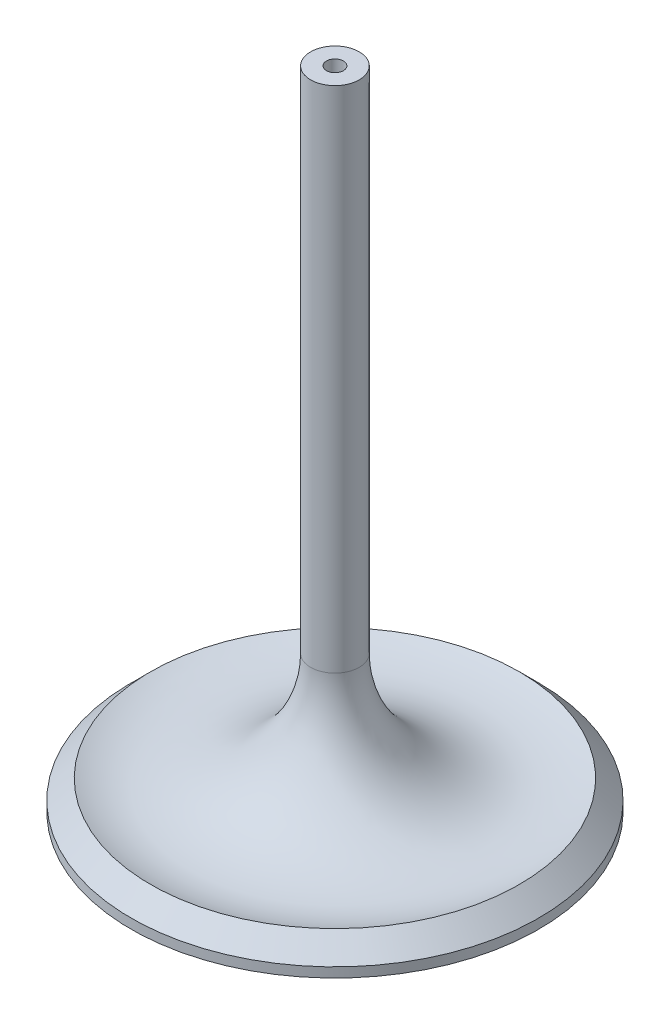
ISO-10303-21;
HEADER;
FILE_DESCRIPTION(('STEP AP214'),'2;1');
FILE_NAME('part.step','',(''),(''),'','','');
FILE_SCHEMA(('AUTOMOTIVE_DESIGN { 1 0 10303 214 1 1 1 1 }'));
ENDSEC;
DATA;
#1=APPLICATION_CONTEXT('core data for automotive mechanical design processes');
#2=APPLICATION_PROTOCOL_DEFINITION('international standard','automotive_design',2000,#1);
#3=PRODUCT_CONTEXT('',#1,'mechanical');
#4=PRODUCT('Part','Part','',(#3));
#5=PRODUCT_RELATED_PRODUCT_CATEGORY('part','',(#4));
#6=PRODUCT_DEFINITION_FORMATION('','',#4);
#7=PRODUCT_DEFINITION_CONTEXT('part definition',#1,'design');
#8=PRODUCT_DEFINITION('design','',#6,#7);
#9=PRODUCT_DEFINITION_SHAPE('','',#8);
#10=(LENGTH_UNIT() NAMED_UNIT(*) SI_UNIT(.MILLI.,.METRE.));
#11=(NAMED_UNIT(*) PLANE_ANGLE_UNIT() SI_UNIT($,.RADIAN.));
#12=(NAMED_UNIT(*) SI_UNIT($,.STERADIAN.) SOLID_ANGLE_UNIT());
#13=UNCERTAINTY_MEASURE_WITH_UNIT(LENGTH_MEASURE(1.E-05),#10,'distance_accuracy_value','');
#14=(GEOMETRIC_REPRESENTATION_CONTEXT(3) GLOBAL_UNCERTAINTY_ASSIGNED_CONTEXT((#13)) GLOBAL_UNIT_ASSIGNED_CONTEXT((#10,
#11,#12)) REPRESENTATION_CONTEXT('',''));
#15=CARTESIAN_POINT('',(0.,0.,0.));
#16=DIRECTION('',(0.,0.,1.));
#17=DIRECTION('',(1.,0.,0.));
#18=AXIS2_PLACEMENT_3D('',#15,#16,#17);
#19=CARTESIAN_POINT('',(0.,-10.65,0.));
#20=DIRECTION('',(0.,1.,0.));
#21=DIRECTION('',(0.,0.,1.));
#22=AXIS2_PLACEMENT_3D('',#19,#20,#21);
#23=CYLINDRICAL_SURFACE('',#22,1.10653535563735);
#24=CARTESIAN_POINT('',(0.,84.55,0.));
#25=DIRECTION('',(0.,1.,0.));
#26=DIRECTION('',(0.,0.,1.));
#27=AXIS2_PLACEMENT_3D('',#24,#25,#26);
#28=CIRCLE('',#27,1.10653535563735);
#29=CARTESIAN_POINT('',(0.,84.55,1.10653535563735));
#30=VERTEX_POINT('',#29);
#31=EDGE_CURVE('E76',#30,#30,#28,.T.);
#32=ORIENTED_EDGE('',*,*,#31,.T.);
#33=EDGE_LOOP('',(#32));
#34=FACE_BOUND('',#33,.T.);
#35=CARTESIAN_POINT('',(0.,2.2,0.));
#36=DIRECTION('',(0.,-1.,0.));
#37=DIRECTION('',(0.,0.,-1.));
#38=AXIS2_PLACEMENT_3D('',#35,#36,#37);
#39=CIRCLE('',#38,1.10653535563735);
#40=CARTESIAN_POINT('',(0.,2.2,-1.10653535563735));
#41=VERTEX_POINT('',#40);
#42=EDGE_CURVE('E47',#41,#41,#39,.F.);
#43=ORIENTED_EDGE('',*,*,#42,.F.);
#44=EDGE_LOOP('',(#43));
#45=FACE_BOUND('',#44,.T.);
#46=ADVANCED_FACE('F43',(#34,#45),#23,.F.);
#47=CARTESIAN_POINT('',(26.67,0.,0.));
#48=DIRECTION('',(0.,-1.,0.));
#49=DIRECTION('',(0.,0.,-1.));
#50=AXIS2_PLACEMENT_3D('',#47,#48,#49);
#51=PLANE('',#50);
#52=CARTESIAN_POINT('',(0.,0.,0.));
#53=DIRECTION('',(0.,-1.,0.));
#54=DIRECTION('',(0.,0.,-1.));
#55=AXIS2_PLACEMENT_3D('',#52,#53,#54);
#56=CIRCLE('',#55,14.510934510606);
#57=CARTESIAN_POINT('',(0.,0.,-14.510934510606));
#58=VERTEX_POINT('',#57);
#59=EDGE_CURVE('E72',#58,#58,#56,.T.);
#60=ORIENTED_EDGE('',*,*,#59,.F.);
#61=EDGE_LOOP('',(#60));
#62=FACE_BOUND('',#61,.T.);
#63=CARTESIAN_POINT('',(0.,0.,0.));
#64=DIRECTION('',(0.,-1.,0.));
#65=DIRECTION('',(0.,0.,-1.));
#66=AXIS2_PLACEMENT_3D('',#63,#64,#65);
#67=CIRCLE('',#66,26.67);
#68=CARTESIAN_POINT('',(0.,0.,-26.67));
#69=VERTEX_POINT('',#68);
#70=EDGE_CURVE('E10',#69,#69,#67,.T.);
#71=ORIENTED_EDGE('',*,*,#70,.T.);
#72=EDGE_LOOP('',(#71));
#73=FACE_BOUND('',#72,.T.);
#74=ADVANCED_FACE('F45',(#62,#73),#51,.T.);
#75=CARTESIAN_POINT('',(0.,0.,0.));
#76=DIRECTION('',(0.,-1.,0.));
#77=DIRECTION('',(0.,0.,-1.));
#78=AXIS2_PLACEMENT_3D('',#75,#76,#77);
#79=CYLINDRICAL_SURFACE('',#78,26.67);
#80=CARTESIAN_POINT('',(0.,1.27,0.));
#81=DIRECTION('',(0.,-1.,0.));
#82=DIRECTION('',(0.,0.,-1.));
#83=AXIS2_PLACEMENT_3D('',#80,#81,#82);
#84=CIRCLE('',#83,26.67);
#85=CARTESIAN_POINT('',(0.,1.27,-26.67));
#86=VERTEX_POINT('',#85);
#87=EDGE_CURVE('E52',#86,#86,#84,.T.);
#88=ORIENTED_EDGE('',*,*,#87,.T.);
#89=EDGE_LOOP('',(#88));
#90=FACE_BOUND('',#89,.T.);
#91=ORIENTED_EDGE('',*,*,#70,.F.);
#92=EDGE_LOOP('',(#91));
#93=FACE_BOUND('',#92,.T.);
#94=ADVANCED_FACE('F104',(#90,#93),#79,.T.);
#95=CARTESIAN_POINT('',(0.,1.27,0.));
#96=DIRECTION('',(0.,-1.,0.));
#97=DIRECTION('',(0.,0.,-1.));
#98=AXIS2_PLACEMENT_3D('',#95,#96,#97);
#99=CONICAL_SURFACE('',#98,26.67,0.785398163397456);
#100=CARTESIAN_POINT('',(0.,3.80999999999999,0.));
#101=DIRECTION('',(0.,-1.,0.));
#102=DIRECTION('',(0.,0.,-1.));
#103=AXIS2_PLACEMENT_3D('',#100,#101,#102);
#104=CIRCLE('',#103,24.13);
#105=CARTESIAN_POINT('',(0.,3.80999999999999,-24.13));
#106=VERTEX_POINT('',#105);
#107=EDGE_CURVE('E57',#106,#106,#104,.T.);
#108=ORIENTED_EDGE('',*,*,#107,.T.);
#109=EDGE_LOOP('',(#108));
#110=FACE_BOUND('',#109,.T.);
#111=ORIENTED_EDGE('',*,*,#87,.F.);
#112=EDGE_LOOP('',(#111));
#113=FACE_BOUND('',#112,.T.);
#114=ADVANCED_FACE('F129',(#110,#113),#99,.T.);
#115=CARTESIAN_POINT('',(0.,17.9546986535592,0.));
#116=DIRECTION('',(0.,-1.,0.));
#117=DIRECTION('',(0.,0.,-1.));
#118=AXIS2_PLACEMENT_3D('',#115,#116,#117);
#119=TOROIDAL_SURFACE('',#118,18.43,15.25);
#120=CARTESIAN_POINT('',(0.,17.9546986535592,0.));
#121=DIRECTION('',(0.,-1.,0.));
#122=DIRECTION('',(0.,0.,-1.));
#123=AXIS2_PLACEMENT_3D('',#120,#121,#122);
#124=CIRCLE('',#123,3.18000000000001);
#125=CARTESIAN_POINT('',(0.,17.9546986535592,-3.18000000000001));
#126=VERTEX_POINT('',#125);
#127=EDGE_CURVE('E63',#126,#126,#124,.T.);
#128=ORIENTED_EDGE('',*,*,#127,.T.);
#129=EDGE_LOOP('',(#128));
#130=FACE_BOUND('',#129,.T.);
#131=ORIENTED_EDGE('',*,*,#107,.F.);
#132=EDGE_LOOP('',(#131));
#133=FACE_BOUND('',#132,.T.);
#134=ADVANCED_FACE('F125',(#130,#133),#119,.F.);
#135=CARTESIAN_POINT('',(0.,0.,0.));
#136=DIRECTION('',(0.,-1.,0.));
#137=DIRECTION('',(0.,0.,-1.));
#138=AXIS2_PLACEMENT_3D('',#135,#136,#137);
#139=CYLINDRICAL_SURFACE('',#138,3.18000000000001);
#140=CARTESIAN_POINT('',(0.,84.55,0.));
#141=DIRECTION('',(0.,-1.,0.));
#142=DIRECTION('',(0.,0.,-1.));
#143=AXIS2_PLACEMENT_3D('',#140,#141,#142);
#144=CIRCLE('',#143,3.18);
#145=CARTESIAN_POINT('',(0.,84.55,-3.18));
#146=VERTEX_POINT('',#145);
#147=EDGE_CURVE('E67',#146,#146,#144,.T.);
#148=ORIENTED_EDGE('',*,*,#147,.T.);
#149=EDGE_LOOP('',(#148));
#150=FACE_BOUND('',#149,.T.);
#151=ORIENTED_EDGE('',*,*,#127,.F.);
#152=EDGE_LOOP('',(#151));
#153=FACE_BOUND('',#152,.T.);
#154=ADVANCED_FACE('F121',(#150,#153),#139,.T.);
#155=CARTESIAN_POINT('',(0.,84.55,0.));
#156=DIRECTION('',(0.,1.,0.));
#157=DIRECTION('',(0.,0.,1.));
#158=AXIS2_PLACEMENT_3D('',#155,#156,#157);
#159=PLANE('',#158);
#160=ORIENTED_EDGE('',*,*,#31,.F.);
#161=EDGE_LOOP('',(#160));
#162=FACE_BOUND('',#161,.T.);
#163=ORIENTED_EDGE('',*,*,#147,.F.);
#164=EDGE_LOOP('',(#163));
#165=FACE_BOUND('',#164,.T.);
#166=ADVANCED_FACE('F117',(#162,#165),#159,.T.);
#167=CARTESIAN_POINT('',(0.,1.2,0.));
#168=DIRECTION('',(0.,-1.,0.));
#169=DIRECTION('',(0.,0.,-1.));
#170=AXIS2_PLACEMENT_3D('',#167,#168,#169);
#171=CYLINDRICAL_SURFACE('',#170,14.510934510606);
#172=CARTESIAN_POINT('',(0.,1.2,0.));
#173=DIRECTION('',(0.,-1.,0.));
#174=DIRECTION('',(0.,0.,-1.));
#175=AXIS2_PLACEMENT_3D('',#172,#173,#174);
#176=CIRCLE('',#175,14.510934510606);
#177=CARTESIAN_POINT('',(0.,1.2,-14.510934510606));
#178=VERTEX_POINT('',#177);
#179=EDGE_CURVE('E71',#178,#178,#176,.T.);
#180=ORIENTED_EDGE('',*,*,#179,.F.);
#181=EDGE_LOOP('',(#180));
#182=FACE_BOUND('',#181,.T.);
#183=ORIENTED_EDGE('',*,*,#59,.T.);
#184=EDGE_LOOP('',(#183));
#185=FACE_BOUND('',#184,.T.);
#186=ADVANCED_FACE('F113',(#182,#185),#171,.F.);
#187=CARTESIAN_POINT('',(0.,1.2,0.));
#188=DIRECTION('',(0.,-1.,0.));
#189=DIRECTION('',(0.,0.,-1.));
#190=AXIS2_PLACEMENT_3D('',#187,#188,#189);
#191=PLANE('',#190);
#192=CARTESIAN_POINT('',(0.,1.2,0.));
#193=DIRECTION('',(0.,-1.,0.));
#194=DIRECTION('',(0.,0.,-1.));
#195=AXIS2_PLACEMENT_3D('',#192,#193,#194);
#196=CIRCLE('',#195,9.06249753190288);
#197=CARTESIAN_POINT('',(0.,1.2,-9.06249753190288));
#198=VERTEX_POINT('',#197);
#199=EDGE_CURVE('E83',#198,#198,#196,.T.);
#200=ORIENTED_EDGE('',*,*,#199,.F.);
#201=EDGE_LOOP('',(#200));
#202=FACE_BOUND('',#201,.T.);
#203=ORIENTED_EDGE('',*,*,#179,.T.);
#204=EDGE_LOOP('',(#203));
#205=FACE_BOUND('',#204,.T.);
#206=ADVANCED_FACE('F110',(#202,#205),#191,.T.);
#207=CARTESIAN_POINT('',(0.,2.2,0.));
#208=DIRECTION('',(0.,-1.,0.));
#209=DIRECTION('',(0.,0.,-1.));
#210=AXIS2_PLACEMENT_3D('',#207,#208,#209);
#211=PLANE('',#210);
#212=CARTESIAN_POINT('',(0.,2.2,0.));
#213=DIRECTION('',(0.,-1.,0.));
#214=DIRECTION('',(0.,0.,-1.));
#215=AXIS2_PLACEMENT_3D('',#212,#213,#214);
#216=CIRCLE('',#215,9.06249753190288);
#217=CARTESIAN_POINT('',(0.,2.2,-9.06249753190288));
#218=VERTEX_POINT('',#217);
#219=EDGE_CURVE('E87',#218,#218,#216,.T.);
#220=ORIENTED_EDGE('',*,*,#219,.T.);
#221=EDGE_LOOP('',(#220));
#222=FACE_BOUND('',#221,.T.);
#223=ORIENTED_EDGE('',*,*,#42,.T.);
#224=EDGE_LOOP('',(#223));
#225=FACE_BOUND('',#224,.T.);
#226=ADVANCED_FACE('F96',(#222,#225),#211,.T.);
#227=CARTESIAN_POINT('',(0.,2.2,0.));
#228=DIRECTION('',(0.,-1.,0.));
#229=DIRECTION('',(0.,0.,-1.));
#230=AXIS2_PLACEMENT_3D('',#227,#228,#229);
#231=CYLINDRICAL_SURFACE('',#230,9.06249753190288);
#232=ORIENTED_EDGE('',*,*,#219,.F.);
#233=EDGE_LOOP('',(#232));
#234=FACE_BOUND('',#233,.T.);
#235=ORIENTED_EDGE('',*,*,#199,.T.);
#236=EDGE_LOOP('',(#235));
#237=FACE_BOUND('',#236,.T.);
#238=ADVANCED_FACE('F108',(#234,#237),#231,.F.);
#239=CLOSED_SHELL('',(#46,#74,#94,#114,#134,#154,#166,#186,#206,#226,#238));
#240=MANIFOLD_SOLID_BREP('B2',#239);
#241=ADVANCED_BREP_SHAPE_REPRESENTATION('',(#18,#240),#14);
#242=SHAPE_DEFINITION_REPRESENTATION(#9,#241);
ENDSEC;
END-ISO-10303-21;
